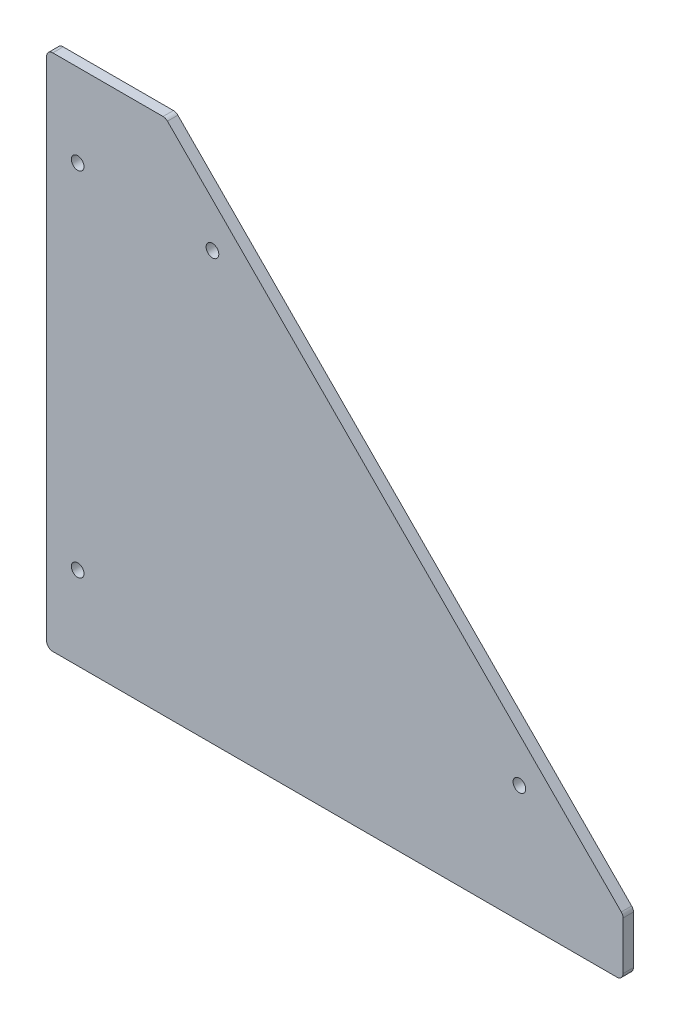
ISO-10303-21;
HEADER;
FILE_DESCRIPTION(('STEP AP214'),'2;1');
FILE_NAME('part.step','',(''),(''),'','','');
FILE_SCHEMA(('AUTOMOTIVE_DESIGN { 1 0 10303 214 1 1 1 1 }'));
ENDSEC;
DATA;
#1=APPLICATION_CONTEXT('core data for automotive mechanical design processes');
#2=APPLICATION_PROTOCOL_DEFINITION('international standard','automotive_design',2000,#1);
#3=PRODUCT_CONTEXT('',#1,'mechanical');
#4=PRODUCT('Part','Part','',(#3));
#5=PRODUCT_RELATED_PRODUCT_CATEGORY('part','',(#4));
#6=PRODUCT_DEFINITION_FORMATION('','',#4);
#7=PRODUCT_DEFINITION_CONTEXT('part definition',#1,'design');
#8=PRODUCT_DEFINITION('design','',#6,#7);
#9=PRODUCT_DEFINITION_SHAPE('','',#8);
#10=(LENGTH_UNIT() NAMED_UNIT(*) SI_UNIT(.MILLI.,.METRE.));
#11=(NAMED_UNIT(*) PLANE_ANGLE_UNIT() SI_UNIT($,.RADIAN.));
#12=(NAMED_UNIT(*) SI_UNIT($,.STERADIAN.) SOLID_ANGLE_UNIT());
#13=UNCERTAINTY_MEASURE_WITH_UNIT(LENGTH_MEASURE(1.E-05),#10,'distance_accuracy_value','');
#14=(GEOMETRIC_REPRESENTATION_CONTEXT(3) GLOBAL_UNCERTAINTY_ASSIGNED_CONTEXT((#13)) GLOBAL_UNIT_ASSIGNED_CONTEXT((#10,
#11,#12)) REPRESENTATION_CONTEXT('',''));
#15=CARTESIAN_POINT('',(0.,0.,0.));
#16=DIRECTION('',(0.,0.,1.));
#17=DIRECTION('',(1.,0.,0.));
#18=AXIS2_PLACEMENT_3D('',#15,#16,#17);
#19=CARTESIAN_POINT('',(0.,0.,5.));
#20=DIRECTION('',(0.,0.,-1.));
#21=DIRECTION('',(-1.,0.,0.));
#22=AXIS2_PLACEMENT_3D('',#19,#20,#21);
#23=PLANE('',#22);
#24=DIRECTION('',(0.,1.,0.));
#25=VECTOR('',#24,1.);
#26=CARTESIAN_POINT('',(278.,27.43,5.));
#27=LINE('',#26,#25);
#28=CARTESIAN_POINT('',(278.,3.00000000000001,5.));
#29=VERTEX_POINT('',#28);
#30=CARTESIAN_POINT('',(278.,26.195283261379,5.));
#31=VERTEX_POINT('',#30);
#32=EDGE_CURVE('E215',#29,#31,#27,.T.);
#33=ORIENTED_EDGE('',*,*,#32,.T.);
#34=CARTESIAN_POINT('',(275.,26.195283261379,5.));
#35=DIRECTION('',(0.,0.,-1.));
#36=DIRECTION('',(-1.,0.,0.));
#37=AXIS2_PLACEMENT_3D('',#34,#35,#36);
#38=CIRCLE('',#37,3.);
#39=CARTESIAN_POINT('',(277.130872682736,28.3070080564149,5.));
#40=VERTEX_POINT('',#39);
#41=EDGE_CURVE('E168',#31,#40,#38,.F.);
#42=ORIENTED_EDGE('',*,*,#41,.T.);
#43=DIRECTION('',(-0.703908265011923,0.710290894245381,0.));
#44=VECTOR('',#43,1.);
#45=CARTESIAN_POINT('',(57.43,250.,5.));
#46=LINE('',#45,#44);
#47=CARTESIAN_POINT('',(58.3102932199261,249.111724795036,5.));
#48=VERTEX_POINT('',#47);
#49=EDGE_CURVE('E131',#40,#48,#46,.T.);
#50=ORIENTED_EDGE('',*,*,#49,.T.);
#51=CARTESIAN_POINT('',(56.17942053719,247.,5.));
#52=DIRECTION('',(0.,0.,-1.));
#53=DIRECTION('',(-1.,0.,0.));
#54=AXIS2_PLACEMENT_3D('',#51,#52,#53);
#55=CIRCLE('',#54,3.);
#56=CARTESIAN_POINT('',(56.17942053719,250.,5.));
#57=VERTEX_POINT('',#56);
#58=EDGE_CURVE('E161',#48,#57,#55,.F.);
#59=ORIENTED_EDGE('',*,*,#58,.T.);
#60=DIRECTION('',(-1.,0.,0.));
#61=VECTOR('',#60,1.);
#62=CARTESIAN_POINT('',(0.,250.,5.));
#63=LINE('',#62,#61);
#64=CARTESIAN_POINT('',(3.,250.,5.));
#65=VERTEX_POINT('',#64);
#66=EDGE_CURVE('E184',#57,#65,#63,.T.);
#67=ORIENTED_EDGE('',*,*,#66,.T.);
#68=CARTESIAN_POINT('',(3.,247.,5.));
#69=DIRECTION('',(0.,0.,-1.));
#70=DIRECTION('',(-1.,0.,0.));
#71=AXIS2_PLACEMENT_3D('',#68,#69,#70);
#72=CIRCLE('',#71,3.);
#73=CARTESIAN_POINT('',(0.,247.,5.));
#74=VERTEX_POINT('',#73);
#75=EDGE_CURVE('E55',#65,#74,#72,.F.);
#76=ORIENTED_EDGE('',*,*,#75,.T.);
#77=DIRECTION('',(0.,-1.,0.));
#78=VECTOR('',#77,1.);
#79=CARTESIAN_POINT('',(0.,0.,5.));
#80=LINE('',#79,#78);
#81=CARTESIAN_POINT('',(0.,3.,5.));
#82=VERTEX_POINT('',#81);
#83=EDGE_CURVE('E150',#74,#82,#80,.T.);
#84=ORIENTED_EDGE('',*,*,#83,.T.);
#85=CARTESIAN_POINT('',(3.,3.,5.));
#86=DIRECTION('',(0.,0.,-1.));
#87=DIRECTION('',(-1.,0.,0.));
#88=AXIS2_PLACEMENT_3D('',#85,#86,#87);
#89=CIRCLE('',#88,3.);
#90=CARTESIAN_POINT('',(3.,0.,5.));
#91=VERTEX_POINT('',#90);
#92=EDGE_CURVE('E164',#82,#91,#89,.F.);
#93=ORIENTED_EDGE('',*,*,#92,.T.);
#94=DIRECTION('',(1.,0.,0.));
#95=VECTOR('',#94,1.);
#96=CARTESIAN_POINT('',(278.,0.,5.));
#97=LINE('',#96,#95);
#98=CARTESIAN_POINT('',(275.,0.,5.));
#99=VERTEX_POINT('',#98);
#100=EDGE_CURVE('E149',#91,#99,#97,.T.);
#101=ORIENTED_EDGE('',*,*,#100,.T.);
#102=CARTESIAN_POINT('',(275.,3.,5.));
#103=DIRECTION('',(0.,0.,-1.));
#104=DIRECTION('',(-1.,0.,0.));
#105=AXIS2_PLACEMENT_3D('',#102,#103,#104);
#106=CIRCLE('',#105,3.);
#107=EDGE_CURVE('E166',#99,#29,#106,.F.);
#108=ORIENTED_EDGE('',*,*,#107,.T.);
#109=EDGE_LOOP('',(#33,#42,#50,#59,#67,#76,#84,#93,#101,#108));
#110=FACE_BOUND('',#109,.T.);
#111=CARTESIAN_POINT('',(15.,210.,5.));
#112=DIRECTION('',(0.,0.,1.));
#113=DIRECTION('',(1.,0.,0.));
#114=AXIS2_PLACEMENT_3D('',#111,#112,#113);
#115=CIRCLE('',#114,3.05);
#116=CARTESIAN_POINT('',(18.05,210.,5.));
#117=VERTEX_POINT('',#116);
#118=EDGE_CURVE('E197',#117,#117,#115,.T.);
#119=ORIENTED_EDGE('',*,*,#118,.F.);
#120=EDGE_LOOP('',(#119));
#121=FACE_BOUND('',#120,.T.);
#122=CARTESIAN_POINT('',(15.,40.,5.));
#123=DIRECTION('',(0.,0.,1.));
#124=DIRECTION('',(1.,0.,0.));
#125=AXIS2_PLACEMENT_3D('',#122,#123,#124);
#126=CIRCLE('',#125,3.05);
#127=CARTESIAN_POINT('',(18.05,40.,5.));
#128=VERTEX_POINT('',#127);
#129=EDGE_CURVE('E207',#128,#128,#126,.T.);
#130=ORIENTED_EDGE('',*,*,#129,.F.);
#131=EDGE_LOOP('',(#130));
#132=FACE_BOUND('',#131,.T.);
#133=CARTESIAN_POINT('',(80.,205.915753478768,5.));
#134=DIRECTION('',(0.,0.,1.));
#135=DIRECTION('',(1.,0.,0.));
#136=AXIS2_PLACEMENT_3D('',#133,#134,#135);
#137=CIRCLE('',#136,3.04999999999999);
#138=CARTESIAN_POINT('',(83.05,205.915753478768,5.));
#139=VERTEX_POINT('',#138);
#140=EDGE_CURVE('E372',#139,#139,#137,.T.);
#141=ORIENTED_EDGE('',*,*,#140,.F.);
#142=EDGE_LOOP('',(#141));
#143=FACE_BOUND('',#142,.T.);
#144=CARTESIAN_POINT('',(228.,56.5737758752862,5.));
#145=DIRECTION('',(0.,0.,1.));
#146=DIRECTION('',(1.,0.,0.));
#147=AXIS2_PLACEMENT_3D('',#144,#145,#146);
#148=CIRCLE('',#147,3.05000000000002);
#149=CARTESIAN_POINT('',(231.05,56.5737758752862,5.));
#150=VERTEX_POINT('',#149);
#151=EDGE_CURVE('E378',#150,#150,#148,.T.);
#152=ORIENTED_EDGE('',*,*,#151,.F.);
#153=EDGE_LOOP('',(#152));
#154=FACE_BOUND('',#153,.T.);
#155=ADVANCED_FACE('F33',(#110,#121,#132,#143,#154),#23,.F.);
#156=CARTESIAN_POINT('',(0.,0.,0.));
#157=DIRECTION('',(0.,0.,-1.));
#158=DIRECTION('',(-1.,0.,0.));
#159=AXIS2_PLACEMENT_3D('',#156,#157,#158);
#160=PLANE('',#159);
#161=CARTESIAN_POINT('',(80.,205.915753478768,0.));
#162=DIRECTION('',(0.,0.,1.));
#163=DIRECTION('',(1.,0.,0.));
#164=AXIS2_PLACEMENT_3D('',#161,#162,#163);
#165=CIRCLE('',#164,3.04999999999999);
#166=CARTESIAN_POINT('',(83.05,205.915753478768,0.));
#167=VERTEX_POINT('',#166);
#168=EDGE_CURVE('E374',#167,#167,#165,.T.);
#169=ORIENTED_EDGE('',*,*,#168,.T.);
#170=EDGE_LOOP('',(#169));
#171=FACE_BOUND('',#170,.T.);
#172=CARTESIAN_POINT('',(15.,210.,0.));
#173=DIRECTION('',(0.,0.,1.));
#174=DIRECTION('',(1.,0.,0.));
#175=AXIS2_PLACEMENT_3D('',#172,#173,#174);
#176=CIRCLE('',#175,3.05);
#177=CARTESIAN_POINT('',(18.05,210.,0.));
#178=VERTEX_POINT('',#177);
#179=EDGE_CURVE('E202',#178,#178,#176,.T.);
#180=ORIENTED_EDGE('',*,*,#179,.T.);
#181=EDGE_LOOP('',(#180));
#182=FACE_BOUND('',#181,.T.);
#183=DIRECTION('',(-0.703908265011923,0.710290894245381,0.));
#184=VECTOR('',#183,1.);
#185=CARTESIAN_POINT('',(57.43,250.,0.));
#186=LINE('',#185,#184);
#187=CARTESIAN_POINT('',(277.130872682736,28.3070080564149,0.));
#188=VERTEX_POINT('',#187);
#189=CARTESIAN_POINT('',(58.3102932199261,249.111724795036,0.));
#190=VERTEX_POINT('',#189);
#191=EDGE_CURVE('E128',#188,#190,#186,.T.);
#192=ORIENTED_EDGE('',*,*,#191,.F.);
#193=CARTESIAN_POINT('',(275.,26.195283261379,0.));
#194=DIRECTION('',(0.,0.,-1.));
#195=DIRECTION('',(-1.,0.,0.));
#196=AXIS2_PLACEMENT_3D('',#193,#194,#195);
#197=CIRCLE('',#196,3.);
#198=CARTESIAN_POINT('',(278.,26.195283261379,0.));
#199=VERTEX_POINT('',#198);
#200=EDGE_CURVE('E111',#188,#199,#197,.T.);
#201=ORIENTED_EDGE('',*,*,#200,.T.);
#202=DIRECTION('',(0.,1.,0.));
#203=VECTOR('',#202,1.);
#204=CARTESIAN_POINT('',(278.,27.43,0.));
#205=LINE('',#204,#203);
#206=CARTESIAN_POINT('',(278.,3.00000000000001,0.));
#207=VERTEX_POINT('',#206);
#208=EDGE_CURVE('E139',#207,#199,#205,.T.);
#209=ORIENTED_EDGE('',*,*,#208,.F.);
#210=CARTESIAN_POINT('',(275.,3.,0.));
#211=DIRECTION('',(0.,0.,-1.));
#212=DIRECTION('',(-1.,0.,0.));
#213=AXIS2_PLACEMENT_3D('',#210,#211,#212);
#214=CIRCLE('',#213,3.);
#215=CARTESIAN_POINT('',(275.,0.,0.));
#216=VERTEX_POINT('',#215);
#217=EDGE_CURVE('E122',#207,#216,#214,.T.);
#218=ORIENTED_EDGE('',*,*,#217,.T.);
#219=DIRECTION('',(1.,0.,0.));
#220=VECTOR('',#219,1.);
#221=CARTESIAN_POINT('',(278.,0.,0.));
#222=LINE('',#221,#220);
#223=CARTESIAN_POINT('',(3.,0.,0.));
#224=VERTEX_POINT('',#223);
#225=EDGE_CURVE('E144',#224,#216,#222,.T.);
#226=ORIENTED_EDGE('',*,*,#225,.F.);
#227=CARTESIAN_POINT('',(3.,3.,0.));
#228=DIRECTION('',(0.,0.,-1.));
#229=DIRECTION('',(-1.,0.,0.));
#230=AXIS2_PLACEMENT_3D('',#227,#228,#229);
#231=CIRCLE('',#230,3.);
#232=CARTESIAN_POINT('',(0.,3.,0.));
#233=VERTEX_POINT('',#232);
#234=EDGE_CURVE('E155',#224,#233,#231,.T.);
#235=ORIENTED_EDGE('',*,*,#234,.T.);
#236=DIRECTION('',(0.,-1.,0.));
#237=VECTOR('',#236,1.);
#238=CARTESIAN_POINT('',(0.,0.,0.));
#239=LINE('',#238,#237);
#240=CARTESIAN_POINT('',(0.,247.,0.));
#241=VERTEX_POINT('',#240);
#242=EDGE_CURVE('E142',#241,#233,#239,.T.);
#243=ORIENTED_EDGE('',*,*,#242,.F.);
#244=CARTESIAN_POINT('',(3.,247.,0.));
#245=DIRECTION('',(0.,0.,-1.));
#246=DIRECTION('',(-1.,0.,0.));
#247=AXIS2_PLACEMENT_3D('',#244,#245,#246);
#248=CIRCLE('',#247,3.);
#249=CARTESIAN_POINT('',(3.,250.,0.));
#250=VERTEX_POINT('',#249);
#251=EDGE_CURVE('E153',#241,#250,#248,.T.);
#252=ORIENTED_EDGE('',*,*,#251,.T.);
#253=DIRECTION('',(-1.,0.,0.));
#254=VECTOR('',#253,1.);
#255=CARTESIAN_POINT('',(0.,250.,0.));
#256=LINE('',#255,#254);
#257=CARTESIAN_POINT('',(56.17942053719,250.,0.));
#258=VERTEX_POINT('',#257);
#259=EDGE_CURVE('E138',#258,#250,#256,.T.);
#260=ORIENTED_EDGE('',*,*,#259,.F.);
#261=CARTESIAN_POINT('',(56.17942053719,247.,0.));
#262=DIRECTION('',(0.,0.,-1.));
#263=DIRECTION('',(-1.,0.,0.));
#264=AXIS2_PLACEMENT_3D('',#261,#262,#263);
#265=CIRCLE('',#264,3.);
#266=EDGE_CURVE('E132',#258,#190,#265,.T.);
#267=ORIENTED_EDGE('',*,*,#266,.T.);
#268=EDGE_LOOP('',(#192,#201,#209,#218,#226,#235,#243,#252,#260,#267));
#269=FACE_BOUND('',#268,.T.);
#270=CARTESIAN_POINT('',(15.,40.,0.));
#271=DIRECTION('',(0.,0.,1.));
#272=DIRECTION('',(1.,0.,0.));
#273=AXIS2_PLACEMENT_3D('',#270,#271,#272);
#274=CIRCLE('',#273,3.05);
#275=CARTESIAN_POINT('',(18.05,40.,0.));
#276=VERTEX_POINT('',#275);
#277=EDGE_CURVE('E210',#276,#276,#274,.T.);
#278=ORIENTED_EDGE('',*,*,#277,.T.);
#279=EDGE_LOOP('',(#278));
#280=FACE_BOUND('',#279,.T.);
#281=CARTESIAN_POINT('',(228.,56.5737758752862,0.));
#282=DIRECTION('',(0.,0.,1.));
#283=DIRECTION('',(1.,0.,0.));
#284=AXIS2_PLACEMENT_3D('',#281,#282,#283);
#285=CIRCLE('',#284,3.05000000000002);
#286=CARTESIAN_POINT('',(231.05,56.5737758752862,0.));
#287=VERTEX_POINT('',#286);
#288=EDGE_CURVE('E381',#287,#287,#285,.T.);
#289=ORIENTED_EDGE('',*,*,#288,.T.);
#290=EDGE_LOOP('',(#289));
#291=FACE_BOUND('',#290,.T.);
#292=ADVANCED_FACE('F135',(#171,#182,#269,#280,#291),#160,.T.);
#293=CARTESIAN_POINT('',(278.,0.,5.));
#294=DIRECTION('',(0.,1.,0.));
#295=DIRECTION('',(0.,0.,1.));
#296=AXIS2_PLACEMENT_3D('',#293,#294,#295);
#297=PLANE('',#296);
#298=ORIENTED_EDGE('',*,*,#225,.T.);
#299=DIRECTION('',(0.,0.,-1.));
#300=VECTOR('',#299,1.);
#301=CARTESIAN_POINT('',(275.,0.,5.));
#302=LINE('',#301,#300);
#303=EDGE_CURVE('E173',#216,#99,#302,.F.);
#304=ORIENTED_EDGE('',*,*,#303,.T.);
#305=ORIENTED_EDGE('',*,*,#100,.F.);
#306=DIRECTION('',(0.,0.,-1.));
#307=VECTOR('',#306,1.);
#308=CARTESIAN_POINT('',(3.,0.,5.));
#309=LINE('',#308,#307);
#310=EDGE_CURVE('E170',#91,#224,#309,.T.);
#311=ORIENTED_EDGE('',*,*,#310,.T.);
#312=EDGE_LOOP('',(#298,#304,#305,#311));
#313=FACE_BOUND('',#312,.T.);
#314=ADVANCED_FACE('F229',(#313),#297,.F.);
#315=CARTESIAN_POINT('',(278.,27.43,5.));
#316=DIRECTION('',(-1.,0.,0.));
#317=DIRECTION('',(0.,0.,1.));
#318=AXIS2_PLACEMENT_3D('',#315,#316,#317);
#319=PLANE('',#318);
#320=ORIENTED_EDGE('',*,*,#208,.T.);
#321=DIRECTION('',(0.,0.,-1.));
#322=VECTOR('',#321,1.);
#323=CARTESIAN_POINT('',(278.,26.195283261379,5.));
#324=LINE('',#323,#322);
#325=EDGE_CURVE('E116',#199,#31,#324,.F.);
#326=ORIENTED_EDGE('',*,*,#325,.T.);
#327=ORIENTED_EDGE('',*,*,#32,.F.);
#328=DIRECTION('',(0.,0.,-1.));
#329=VECTOR('',#328,1.);
#330=CARTESIAN_POINT('',(278.,3.,5.));
#331=LINE('',#330,#329);
#332=EDGE_CURVE('E121',#29,#207,#331,.T.);
#333=ORIENTED_EDGE('',*,*,#332,.T.);
#334=EDGE_LOOP('',(#320,#326,#327,#333));
#335=FACE_BOUND('',#334,.T.);
#336=ADVANCED_FACE('F242',(#335),#319,.F.);
#337=CARTESIAN_POINT('',(57.43,250.,5.));
#338=DIRECTION('',(-0.710290894245381,-0.703908265011923,0.));
#339=DIRECTION('',(0.703908265011923,-0.710290894245381,0.));
#340=AXIS2_PLACEMENT_3D('',#337,#338,#339);
#341=PLANE('',#340);
#342=ORIENTED_EDGE('',*,*,#49,.F.);
#343=DIRECTION('',(0.,0.,-1.));
#344=VECTOR('',#343,1.);
#345=CARTESIAN_POINT('',(277.130872682736,28.3070080564148,5.));
#346=LINE('',#345,#344);
#347=EDGE_CURVE('E115',#40,#188,#346,.T.);
#348=ORIENTED_EDGE('',*,*,#347,.T.);
#349=ORIENTED_EDGE('',*,*,#191,.T.);
#350=DIRECTION('',(0.,0.,-1.));
#351=VECTOR('',#350,1.);
#352=CARTESIAN_POINT('',(58.3102932199261,249.111724795036,5.));
#353=LINE('',#352,#351);
#354=EDGE_CURVE('E133',#190,#48,#353,.F.);
#355=ORIENTED_EDGE('',*,*,#354,.T.);
#356=EDGE_LOOP('',(#342,#348,#349,#355));
#357=FACE_BOUND('',#356,.T.);
#358=ADVANCED_FACE('F127',(#357),#341,.F.);
#359=CARTESIAN_POINT('',(0.,250.,5.));
#360=DIRECTION('',(0.,-1.,0.));
#361=DIRECTION('',(0.,0.,-1.));
#362=AXIS2_PLACEMENT_3D('',#359,#360,#361);
#363=PLANE('',#362);
#364=ORIENTED_EDGE('',*,*,#259,.T.);
#365=DIRECTION('',(0.,0.,-1.));
#366=VECTOR('',#365,1.);
#367=CARTESIAN_POINT('',(3.,250.,5.));
#368=LINE('',#367,#366);
#369=EDGE_CURVE('E11',#250,#65,#368,.F.);
#370=ORIENTED_EDGE('',*,*,#369,.T.);
#371=ORIENTED_EDGE('',*,*,#66,.F.);
#372=DIRECTION('',(0.,0.,-1.));
#373=VECTOR('',#372,1.);
#374=CARTESIAN_POINT('',(56.17942053719,250.,5.));
#375=LINE('',#374,#373);
#376=EDGE_CURVE('E41',#57,#258,#375,.T.);
#377=ORIENTED_EDGE('',*,*,#376,.T.);
#378=EDGE_LOOP('',(#364,#370,#371,#377));
#379=FACE_BOUND('',#378,.T.);
#380=ADVANCED_FACE('F182',(#379),#363,.F.);
#381=CARTESIAN_POINT('',(0.,0.,5.));
#382=DIRECTION('',(1.,0.,0.));
#383=DIRECTION('',(0.,0.,-1.));
#384=AXIS2_PLACEMENT_3D('',#381,#382,#383);
#385=PLANE('',#384);
#386=ORIENTED_EDGE('',*,*,#242,.T.);
#387=DIRECTION('',(0.,0.,-1.));
#388=VECTOR('',#387,1.);
#389=CARTESIAN_POINT('',(0.,3.,5.));
#390=LINE('',#389,#388);
#391=EDGE_CURVE('E48',#233,#82,#390,.F.);
#392=ORIENTED_EDGE('',*,*,#391,.T.);
#393=ORIENTED_EDGE('',*,*,#83,.F.);
#394=DIRECTION('',(0.,0.,-1.));
#395=VECTOR('',#394,1.);
#396=CARTESIAN_POINT('',(0.,247.,5.));
#397=LINE('',#396,#395);
#398=EDGE_CURVE('E175',#74,#241,#397,.T.);
#399=ORIENTED_EDGE('',*,*,#398,.T.);
#400=EDGE_LOOP('',(#386,#392,#393,#399));
#401=FACE_BOUND('',#400,.T.);
#402=ADVANCED_FACE('F191',(#401),#385,.F.);
#403=CARTESIAN_POINT('',(15.,210.,5.));
#404=DIRECTION('',(0.,0.,-1.));
#405=DIRECTION('',(-1.,0.,0.));
#406=AXIS2_PLACEMENT_3D('',#403,#404,#405);
#407=CYLINDRICAL_SURFACE('',#406,3.05);
#408=ORIENTED_EDGE('',*,*,#118,.T.);
#409=EDGE_LOOP('',(#408));
#410=FACE_BOUND('',#409,.T.);
#411=ORIENTED_EDGE('',*,*,#179,.F.);
#412=EDGE_LOOP('',(#411));
#413=FACE_BOUND('',#412,.T.);
#414=ADVANCED_FACE('F233',(#410,#413),#407,.F.);
#415=CARTESIAN_POINT('',(15.,40.,5.));
#416=DIRECTION('',(0.,0.,-1.));
#417=DIRECTION('',(-1.,0.,0.));
#418=AXIS2_PLACEMENT_3D('',#415,#416,#417);
#419=CYLINDRICAL_SURFACE('',#418,3.05);
#420=ORIENTED_EDGE('',*,*,#129,.T.);
#421=EDGE_LOOP('',(#420));
#422=FACE_BOUND('',#421,.T.);
#423=ORIENTED_EDGE('',*,*,#277,.F.);
#424=EDGE_LOOP('',(#423));
#425=FACE_BOUND('',#424,.T.);
#426=ADVANCED_FACE('F303',(#422,#425),#419,.F.);
#427=CARTESIAN_POINT('',(80.,205.915753478768,5.));
#428=DIRECTION('',(0.,0.,-1.));
#429=DIRECTION('',(-1.,0.,0.));
#430=AXIS2_PLACEMENT_3D('',#427,#428,#429);
#431=CYLINDRICAL_SURFACE('',#430,3.04999999999999);
#432=ORIENTED_EDGE('',*,*,#140,.T.);
#433=EDGE_LOOP('',(#432));
#434=FACE_BOUND('',#433,.T.);
#435=ORIENTED_EDGE('',*,*,#168,.F.);
#436=EDGE_LOOP('',(#435));
#437=FACE_BOUND('',#436,.T.);
#438=ADVANCED_FACE('F294',(#434,#437),#431,.F.);
#439=CARTESIAN_POINT('',(228.,56.5737758752862,5.));
#440=DIRECTION('',(0.,0.,-1.));
#441=DIRECTION('',(-1.,0.,0.));
#442=AXIS2_PLACEMENT_3D('',#439,#440,#441);
#443=CYLINDRICAL_SURFACE('',#442,3.05000000000002);
#444=ORIENTED_EDGE('',*,*,#151,.T.);
#445=EDGE_LOOP('',(#444));
#446=FACE_BOUND('',#445,.T.);
#447=ORIENTED_EDGE('',*,*,#288,.F.);
#448=EDGE_LOOP('',(#447));
#449=FACE_BOUND('',#448,.T.);
#450=ADVANCED_FACE('F251',(#446,#449),#443,.F.);
#451=CARTESIAN_POINT('',(275.,26.195283261379,5.));
#452=DIRECTION('',(0.,0.,-1.));
#453=DIRECTION('',(-1.,0.,0.));
#454=AXIS2_PLACEMENT_3D('',#451,#452,#453);
#455=CYLINDRICAL_SURFACE('',#454,3.);
#456=ORIENTED_EDGE('',*,*,#41,.F.);
#457=ORIENTED_EDGE('',*,*,#325,.F.);
#458=ORIENTED_EDGE('',*,*,#200,.F.);
#459=ORIENTED_EDGE('',*,*,#347,.F.);
#460=EDGE_LOOP('',(#456,#457,#458,#459));
#461=FACE_BOUND('',#460,.T.);
#462=ADVANCED_FACE('F114',(#461),#455,.T.);
#463=CARTESIAN_POINT('',(275.,3.,5.));
#464=DIRECTION('',(0.,0.,-1.));
#465=DIRECTION('',(-1.,0.,0.));
#466=AXIS2_PLACEMENT_3D('',#463,#464,#465);
#467=CYLINDRICAL_SURFACE('',#466,3.);
#468=ORIENTED_EDGE('',*,*,#107,.F.);
#469=ORIENTED_EDGE('',*,*,#303,.F.);
#470=ORIENTED_EDGE('',*,*,#217,.F.);
#471=ORIENTED_EDGE('',*,*,#332,.F.);
#472=EDGE_LOOP('',(#468,#469,#470,#471));
#473=FACE_BOUND('',#472,.T.);
#474=ADVANCED_FACE('F250',(#473),#467,.T.);
#475=CARTESIAN_POINT('',(3.,3.,5.));
#476=DIRECTION('',(0.,0.,-1.));
#477=DIRECTION('',(-1.,0.,0.));
#478=AXIS2_PLACEMENT_3D('',#475,#476,#477);
#479=CYLINDRICAL_SURFACE('',#478,3.);
#480=ORIENTED_EDGE('',*,*,#92,.F.);
#481=ORIENTED_EDGE('',*,*,#391,.F.);
#482=ORIENTED_EDGE('',*,*,#234,.F.);
#483=ORIENTED_EDGE('',*,*,#310,.F.);
#484=EDGE_LOOP('',(#480,#481,#482,#483));
#485=FACE_BOUND('',#484,.T.);
#486=ADVANCED_FACE('F222',(#485),#479,.T.);
#487=CARTESIAN_POINT('',(3.,247.,5.));
#488=DIRECTION('',(0.,0.,-1.));
#489=DIRECTION('',(-1.,0.,0.));
#490=AXIS2_PLACEMENT_3D('',#487,#488,#489);
#491=CYLINDRICAL_SURFACE('',#490,3.);
#492=ORIENTED_EDGE('',*,*,#75,.F.);
#493=ORIENTED_EDGE('',*,*,#369,.F.);
#494=ORIENTED_EDGE('',*,*,#251,.F.);
#495=ORIENTED_EDGE('',*,*,#398,.F.);
#496=EDGE_LOOP('',(#492,#493,#494,#495));
#497=FACE_BOUND('',#496,.T.);
#498=ADVANCED_FACE('F190',(#497),#491,.T.);
#499=CARTESIAN_POINT('',(56.17942053719,247.,5.));
#500=DIRECTION('',(0.,0.,-1.));
#501=DIRECTION('',(-1.,0.,0.));
#502=AXIS2_PLACEMENT_3D('',#499,#500,#501);
#503=CYLINDRICAL_SURFACE('',#502,3.);
#504=ORIENTED_EDGE('',*,*,#58,.F.);
#505=ORIENTED_EDGE('',*,*,#354,.F.);
#506=ORIENTED_EDGE('',*,*,#266,.F.);
#507=ORIENTED_EDGE('',*,*,#376,.F.);
#508=EDGE_LOOP('',(#504,#505,#506,#507));
#509=FACE_BOUND('',#508,.T.);
#510=ADVANCED_FACE('F35',(#509),#503,.T.);
#511=CLOSED_SHELL('',(#155,#292,#314,#336,#358,#380,#402,#414,#426,#438,#450,#462,#474,#486,
#498,#510));
#512=MANIFOLD_SOLID_BREP('B2',#511);
#513=ADVANCED_BREP_SHAPE_REPRESENTATION('',(#18,#512),#14);
#514=SHAPE_DEFINITION_REPRESENTATION(#9,#513);
ENDSEC;
END-ISO-10303-21;
